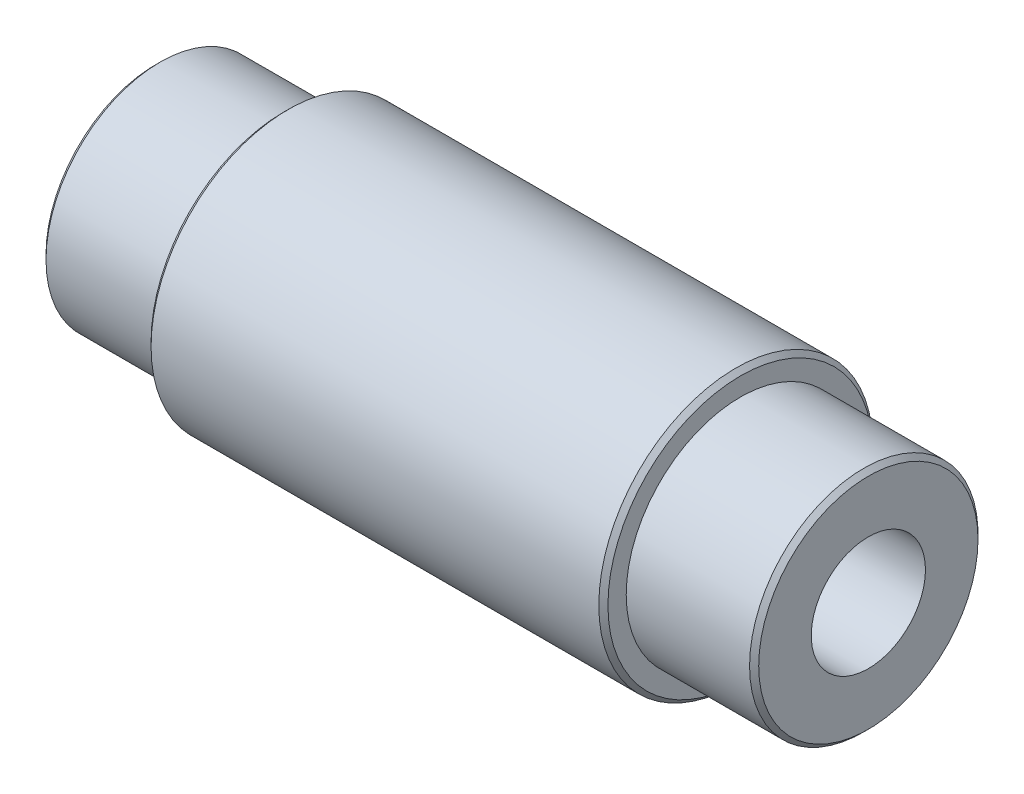
ISO-10303-21;
HEADER;
FILE_DESCRIPTION(('STEP AP214'),'2;1');
FILE_NAME('part.step','',(''),(''),'','','');
FILE_SCHEMA(('AUTOMOTIVE_DESIGN { 1 0 10303 214 1 1 1 1 }'));
ENDSEC;
DATA;
#1=APPLICATION_CONTEXT('core data for automotive mechanical design processes');
#2=APPLICATION_PROTOCOL_DEFINITION('international standard','automotive_design',2000,#1);
#3=PRODUCT_CONTEXT('',#1,'mechanical');
#4=PRODUCT('Part','Part','',(#3));
#5=PRODUCT_RELATED_PRODUCT_CATEGORY('part','',(#4));
#6=PRODUCT_DEFINITION_FORMATION('','',#4);
#7=PRODUCT_DEFINITION_CONTEXT('part definition',#1,'design');
#8=PRODUCT_DEFINITION('design','',#6,#7);
#9=PRODUCT_DEFINITION_SHAPE('','',#8);
#10=(LENGTH_UNIT() NAMED_UNIT(*) SI_UNIT(.MILLI.,.METRE.));
#11=(NAMED_UNIT(*) PLANE_ANGLE_UNIT() SI_UNIT($,.RADIAN.));
#12=(NAMED_UNIT(*) SI_UNIT($,.STERADIAN.) SOLID_ANGLE_UNIT());
#13=UNCERTAINTY_MEASURE_WITH_UNIT(LENGTH_MEASURE(1.E-05),#10,'distance_accuracy_value','');
#14=(GEOMETRIC_REPRESENTATION_CONTEXT(3) GLOBAL_UNCERTAINTY_ASSIGNED_CONTEXT((#13)) GLOBAL_UNIT_ASSIGNED_CONTEXT((#10,
#11,#12)) REPRESENTATION_CONTEXT('',''));
#15=CARTESIAN_POINT('',(0.,0.,0.));
#16=DIRECTION('',(0.,0.,1.));
#17=DIRECTION('',(1.,0.,0.));
#18=AXIS2_PLACEMENT_3D('',#15,#16,#17);
#19=CARTESIAN_POINT('',(-7.8,0.,0.));
#20=DIRECTION('',(1.,0.,0.));
#21=DIRECTION('',(0.,0.,-1.));
#22=AXIS2_PLACEMENT_3D('',#19,#20,#21);
#23=PLANE('',#22);
#24=CARTESIAN_POINT('',(-7.8,0.,0.));
#25=DIRECTION('',(1.,0.,0.));
#26=DIRECTION('',(0.,0.,-1.));
#27=AXIS2_PLACEMENT_3D('',#24,#25,#26);
#28=CIRCLE('',#27,2.4);
#29=CARTESIAN_POINT('',(-7.8,0.,-2.4));
#30=VERTEX_POINT('',#29);
#31=EDGE_CURVE('E60',#30,#30,#28,.F.);
#32=ORIENTED_EDGE('',*,*,#31,.T.);
#33=EDGE_LOOP('',(#32));
#34=FACE_BOUND('',#33,.T.);
#35=CARTESIAN_POINT('',(-7.8,0.,0.));
#36=DIRECTION('',(-1.,0.,0.));
#37=DIRECTION('',(0.,0.,1.));
#38=AXIS2_PLACEMENT_3D('',#35,#36,#37);
#39=CIRCLE('',#38,1.24999999999999);
#40=CARTESIAN_POINT('',(-7.8,0.,1.24999999999999));
#41=VERTEX_POINT('',#40);
#42=EDGE_CURVE('E76',#41,#41,#39,.T.);
#43=ORIENTED_EDGE('',*,*,#42,.F.);
#44=EDGE_LOOP('',(#43));
#45=FACE_BOUND('',#44,.T.);
#46=ADVANCED_FACE('F52',(#34,#45),#23,.F.);
#47=CARTESIAN_POINT('',(-7.8,0.,0.));
#48=DIRECTION('',(-1.,0.,0.));
#49=DIRECTION('',(0.,0.,1.));
#50=AXIS2_PLACEMENT_3D('',#47,#48,#49);
#51=CYLINDRICAL_SURFACE('',#50,2.5);
#52=CARTESIAN_POINT('',(-7.7,0.,0.));
#53=DIRECTION('',(1.,0.,0.));
#54=DIRECTION('',(0.,0.,-1.));
#55=AXIS2_PLACEMENT_3D('',#52,#53,#54);
#56=CIRCLE('',#55,2.5);
#57=CARTESIAN_POINT('',(-7.7,0.,-2.5));
#58=VERTEX_POINT('',#57);
#59=EDGE_CURVE('E13',#58,#58,#56,.T.);
#60=ORIENTED_EDGE('',*,*,#59,.T.);
#61=EDGE_LOOP('',(#60));
#62=FACE_BOUND('',#61,.T.);
#63=CARTESIAN_POINT('',(-5.,0.,0.));
#64=DIRECTION('',(-1.,0.,0.));
#65=DIRECTION('',(0.,0.,1.));
#66=AXIS2_PLACEMENT_3D('',#63,#64,#65);
#67=CIRCLE('',#66,2.5);
#68=CARTESIAN_POINT('',(-5.,0.,2.5));
#69=VERTEX_POINT('',#68);
#70=EDGE_CURVE('E90',#69,#69,#67,.T.);
#71=ORIENTED_EDGE('',*,*,#70,.T.);
#72=EDGE_LOOP('',(#71));
#73=FACE_BOUND('',#72,.T.);
#74=ADVANCED_FACE('F125',(#62,#73),#51,.T.);
#75=CARTESIAN_POINT('',(-5.,2.5,0.));
#76=DIRECTION('',(1.,0.,0.));
#77=DIRECTION('',(0.,0.,-1.));
#78=AXIS2_PLACEMENT_3D('',#75,#76,#77);
#79=PLANE('',#78);
#80=CARTESIAN_POINT('',(-5.,0.,0.));
#81=DIRECTION('',(1.,0.,0.));
#82=DIRECTION('',(0.,0.,-1.));
#83=AXIS2_PLACEMENT_3D('',#80,#81,#82);
#84=CIRCLE('',#83,2.9);
#85=CARTESIAN_POINT('',(-5.,0.,-2.9));
#86=VERTEX_POINT('',#85);
#87=EDGE_CURVE('E108',#86,#86,#84,.F.);
#88=ORIENTED_EDGE('',*,*,#87,.T.);
#89=EDGE_LOOP('',(#88));
#90=FACE_BOUND('',#89,.T.);
#91=ORIENTED_EDGE('',*,*,#70,.F.);
#92=EDGE_LOOP('',(#91));
#93=FACE_BOUND('',#92,.T.);
#94=ADVANCED_FACE('F130',(#90,#93),#79,.F.);
#95=CARTESIAN_POINT('',(-7.8,0.,0.));
#96=DIRECTION('',(-1.,0.,0.));
#97=DIRECTION('',(0.,0.,1.));
#98=AXIS2_PLACEMENT_3D('',#95,#96,#97);
#99=CYLINDRICAL_SURFACE('',#98,3.);
#100=CARTESIAN_POINT('',(4.9,0.,0.));
#101=DIRECTION('',(-1.,0.,0.));
#102=DIRECTION('',(0.,0.,1.));
#103=AXIS2_PLACEMENT_3D('',#100,#101,#102);
#104=CIRCLE('',#103,3.);
#105=CARTESIAN_POINT('',(4.9,0.,3.));
#106=VERTEX_POINT('',#105);
#107=EDGE_CURVE('E102',#106,#106,#104,.T.);
#108=ORIENTED_EDGE('',*,*,#107,.T.);
#109=EDGE_LOOP('',(#108));
#110=FACE_BOUND('',#109,.T.);
#111=CARTESIAN_POINT('',(-4.9,0.,0.));
#112=DIRECTION('',(1.,0.,0.));
#113=DIRECTION('',(0.,0.,-1.));
#114=AXIS2_PLACEMENT_3D('',#111,#112,#113);
#115=CIRCLE('',#114,3.);
#116=CARTESIAN_POINT('',(-4.9,0.,-3.));
#117=VERTEX_POINT('',#116);
#118=EDGE_CURVE('E99',#117,#117,#115,.T.);
#119=ORIENTED_EDGE('',*,*,#118,.T.);
#120=EDGE_LOOP('',(#119));
#121=FACE_BOUND('',#120,.T.);
#122=ADVANCED_FACE('F147',(#110,#121),#99,.T.);
#123=CARTESIAN_POINT('',(5.,3.,0.));
#124=DIRECTION('',(-1.,0.,0.));
#125=DIRECTION('',(0.,0.,1.));
#126=AXIS2_PLACEMENT_3D('',#123,#124,#125);
#127=PLANE('',#126);
#128=CARTESIAN_POINT('',(5.,0.,0.));
#129=DIRECTION('',(-1.,0.,0.));
#130=DIRECTION('',(0.,0.,1.));
#131=AXIS2_PLACEMENT_3D('',#128,#129,#130);
#132=CIRCLE('',#131,2.9);
#133=CARTESIAN_POINT('',(5.,0.,2.9));
#134=VERTEX_POINT('',#133);
#135=EDGE_CURVE('E105',#134,#134,#132,.F.);
#136=ORIENTED_EDGE('',*,*,#135,.T.);
#137=EDGE_LOOP('',(#136));
#138=FACE_BOUND('',#137,.T.);
#139=CARTESIAN_POINT('',(5.,0.,0.));
#140=DIRECTION('',(-1.,0.,0.));
#141=DIRECTION('',(0.,0.,1.));
#142=AXIS2_PLACEMENT_3D('',#139,#140,#141);
#143=CIRCLE('',#142,2.5);
#144=CARTESIAN_POINT('',(5.,0.,2.5));
#145=VERTEX_POINT('',#144);
#146=EDGE_CURVE('E87',#145,#145,#143,.T.);
#147=ORIENTED_EDGE('',*,*,#146,.T.);
#148=EDGE_LOOP('',(#147));
#149=FACE_BOUND('',#148,.T.);
#150=ADVANCED_FACE('F150',(#138,#149),#127,.F.);
#151=CARTESIAN_POINT('',(-7.8,0.,0.));
#152=DIRECTION('',(-1.,0.,0.));
#153=DIRECTION('',(0.,0.,1.));
#154=AXIS2_PLACEMENT_3D('',#151,#152,#153);
#155=CYLINDRICAL_SURFACE('',#154,2.5);
#156=CARTESIAN_POINT('',(7.69999999999999,0.,0.));
#157=DIRECTION('',(-1.,0.,0.));
#158=DIRECTION('',(0.,0.,1.));
#159=AXIS2_PLACEMENT_3D('',#156,#157,#158);
#160=CIRCLE('',#159,2.5);
#161=CARTESIAN_POINT('',(7.69999999999999,0.,2.5));
#162=VERTEX_POINT('',#161);
#163=EDGE_CURVE('E93',#162,#162,#160,.T.);
#164=ORIENTED_EDGE('',*,*,#163,.T.);
#165=EDGE_LOOP('',(#164));
#166=FACE_BOUND('',#165,.T.);
#167=ORIENTED_EDGE('',*,*,#146,.F.);
#168=EDGE_LOOP('',(#167));
#169=FACE_BOUND('',#168,.T.);
#170=ADVANCED_FACE('F165',(#166,#169),#155,.T.);
#171=CARTESIAN_POINT('',(7.8,2.5,0.));
#172=DIRECTION('',(-1.,0.,0.));
#173=DIRECTION('',(0.,0.,1.));
#174=AXIS2_PLACEMENT_3D('',#171,#172,#173);
#175=PLANE('',#174);
#176=CARTESIAN_POINT('',(7.8,0.,0.));
#177=DIRECTION('',(-1.,0.,0.));
#178=DIRECTION('',(0.,0.,1.));
#179=AXIS2_PLACEMENT_3D('',#176,#177,#178);
#180=CIRCLE('',#179,2.4);
#181=CARTESIAN_POINT('',(7.8,0.,2.4));
#182=VERTEX_POINT('',#181);
#183=EDGE_CURVE('E96',#182,#182,#180,.F.);
#184=ORIENTED_EDGE('',*,*,#183,.T.);
#185=EDGE_LOOP('',(#184));
#186=FACE_BOUND('',#185,.T.);
#187=CARTESIAN_POINT('',(7.8,0.,0.));
#188=DIRECTION('',(1.,0.,0.));
#189=DIRECTION('',(0.,0.,-1.));
#190=AXIS2_PLACEMENT_3D('',#187,#188,#189);
#191=CIRCLE('',#190,1.24999999999999);
#192=CARTESIAN_POINT('',(7.8,0.,-1.24999999999999));
#193=VERTEX_POINT('',#192);
#194=EDGE_CURVE('E77',#193,#193,#191,.T.);
#195=ORIENTED_EDGE('',*,*,#194,.F.);
#196=EDGE_LOOP('',(#195));
#197=FACE_BOUND('',#196,.T.);
#198=ADVANCED_FACE('F169',(#186,#197),#175,.F.);
#199=CARTESIAN_POINT('',(-1.8,0.,0.));
#200=DIRECTION('',(-1.,0.,0.));
#201=DIRECTION('',(0.,0.,1.));
#202=AXIS2_PLACEMENT_3D('',#199,#200,#201);
#203=CONICAL_SURFACE('',#202,1.25,1.02974425867665);
#204=CARTESIAN_POINT('',(-1.04892422621555,0.,0.));
#205=VERTEX_POINT('',#204);
#206=VERTEX_LOOP('',#205);
#207=FACE_BOUND('',#206,.T.);
#208=CARTESIAN_POINT('',(-1.8,0.,0.));
#209=DIRECTION('',(-1.,0.,0.));
#210=DIRECTION('',(0.,0.,1.));
#211=AXIS2_PLACEMENT_3D('',#208,#209,#210);
#212=CIRCLE('',#211,1.25);
#213=CARTESIAN_POINT('',(-1.8,0.,1.25));
#214=VERTEX_POINT('',#213);
#215=EDGE_CURVE('E80',#214,#214,#212,.T.);
#216=ORIENTED_EDGE('',*,*,#215,.T.);
#217=EDGE_LOOP('',(#216));
#218=FACE_BOUND('',#217,.T.);
#219=ADVANCED_FACE('F173',(#207,#218),#203,.F.);
#220=CARTESIAN_POINT('',(-7.8,0.,0.));
#221=DIRECTION('',(-1.,0.,0.));
#222=DIRECTION('',(0.,0.,1.));
#223=AXIS2_PLACEMENT_3D('',#220,#221,#222);
#224=CYLINDRICAL_SURFACE('',#223,1.24999999999999);
#225=ORIENTED_EDGE('',*,*,#215,.F.);
#226=EDGE_LOOP('',(#225));
#227=FACE_BOUND('',#226,.T.);
#228=ORIENTED_EDGE('',*,*,#42,.T.);
#229=EDGE_LOOP('',(#228));
#230=FACE_BOUND('',#229,.T.);
#231=ADVANCED_FACE('F70',(#227,#230),#224,.F.);
#232=CARTESIAN_POINT('',(1.3,0.,0.));
#233=DIRECTION('',(1.,0.,0.));
#234=DIRECTION('',(0.,0.,-1.));
#235=AXIS2_PLACEMENT_3D('',#232,#233,#234);
#236=CONICAL_SURFACE('',#235,1.25,1.02974425867665);
#237=CARTESIAN_POINT('',(0.548924226215549,0.,0.));
#238=VERTEX_POINT('',#237);
#239=VERTEX_LOOP('',#238);
#240=FACE_BOUND('',#239,.T.);
#241=CARTESIAN_POINT('',(1.3,0.,0.));
#242=DIRECTION('',(1.,0.,0.));
#243=DIRECTION('',(0.,0.,-1.));
#244=AXIS2_PLACEMENT_3D('',#241,#242,#243);
#245=CIRCLE('',#244,1.25);
#246=CARTESIAN_POINT('',(1.3,0.,-1.25));
#247=VERTEX_POINT('',#246);
#248=EDGE_CURVE('E74',#247,#247,#245,.T.);
#249=ORIENTED_EDGE('',*,*,#248,.T.);
#250=EDGE_LOOP('',(#249));
#251=FACE_BOUND('',#250,.T.);
#252=ADVANCED_FACE('F66',(#240,#251),#236,.F.);
#253=CARTESIAN_POINT('',(7.8,0.,0.));
#254=DIRECTION('',(1.,0.,0.));
#255=DIRECTION('',(0.,0.,-1.));
#256=AXIS2_PLACEMENT_3D('',#253,#254,#255);
#257=CYLINDRICAL_SURFACE('',#256,1.24999999999999);
#258=ORIENTED_EDGE('',*,*,#248,.F.);
#259=EDGE_LOOP('',(#258));
#260=FACE_BOUND('',#259,.T.);
#261=ORIENTED_EDGE('',*,*,#194,.T.);
#262=EDGE_LOOP('',(#261));
#263=FACE_BOUND('',#262,.T.);
#264=ADVANCED_FACE('F69',(#260,#263),#257,.F.);
#265=CARTESIAN_POINT('',(7.69999999999999,0.,0.));
#266=DIRECTION('',(-1.,0.,0.));
#267=DIRECTION('',(0.,0.,1.));
#268=AXIS2_PLACEMENT_3D('',#265,#266,#267);
#269=CONICAL_SURFACE('',#268,2.5,0.785398163397446);
#270=ORIENTED_EDGE('',*,*,#183,.F.);
#271=EDGE_LOOP('',(#270));
#272=FACE_BOUND('',#271,.T.);
#273=ORIENTED_EDGE('',*,*,#163,.F.);
#274=EDGE_LOOP('',(#273));
#275=FACE_BOUND('',#274,.T.);
#276=ADVANCED_FACE('F135',(#272,#275),#269,.T.);
#277=CARTESIAN_POINT('',(4.9,0.,0.));
#278=DIRECTION('',(-1.,0.,0.));
#279=DIRECTION('',(0.,0.,1.));
#280=AXIS2_PLACEMENT_3D('',#277,#278,#279);
#281=CONICAL_SURFACE('',#280,3.,0.785398163397438);
#282=ORIENTED_EDGE('',*,*,#135,.F.);
#283=EDGE_LOOP('',(#282));
#284=FACE_BOUND('',#283,.T.);
#285=ORIENTED_EDGE('',*,*,#107,.F.);
#286=EDGE_LOOP('',(#285));
#287=FACE_BOUND('',#286,.T.);
#288=ADVANCED_FACE('F121',(#284,#287),#281,.T.);
#289=CARTESIAN_POINT('',(-5.,0.,0.));
#290=DIRECTION('',(1.,0.,0.));
#291=DIRECTION('',(0.,0.,-1.));
#292=AXIS2_PLACEMENT_3D('',#289,#290,#291);
#293=CONICAL_SURFACE('',#292,2.9,0.785398163397444);
#294=ORIENTED_EDGE('',*,*,#118,.F.);
#295=EDGE_LOOP('',(#294));
#296=FACE_BOUND('',#295,.T.);
#297=ORIENTED_EDGE('',*,*,#87,.F.);
#298=EDGE_LOOP('',(#297));
#299=FACE_BOUND('',#298,.T.);
#300=ADVANCED_FACE('F116',(#296,#299),#293,.T.);
#301=CARTESIAN_POINT('',(-7.8,0.,0.));
#302=DIRECTION('',(1.,0.,0.));
#303=DIRECTION('',(0.,0.,-1.));
#304=AXIS2_PLACEMENT_3D('',#301,#302,#303);
#305=CONICAL_SURFACE('',#304,2.4,0.785398163397446);
#306=ORIENTED_EDGE('',*,*,#59,.F.);
#307=EDGE_LOOP('',(#306));
#308=FACE_BOUND('',#307,.T.);
#309=ORIENTED_EDGE('',*,*,#31,.F.);
#310=EDGE_LOOP('',(#309));
#311=FACE_BOUND('',#310,.T.);
#312=ADVANCED_FACE('F54',(#308,#311),#305,.T.);
#313=CLOSED_SHELL('',(#46,#74,#94,#122,#150,#170,#198,#219,#231,#252,#264,#276,#288,#300,#312));
#314=MANIFOLD_SOLID_BREP('B2',#313);
#315=ADVANCED_BREP_SHAPE_REPRESENTATION('',(#18,#314),#14);
#316=SHAPE_DEFINITION_REPRESENTATION(#9,#315);
ENDSEC;
END-ISO-10303-21;
